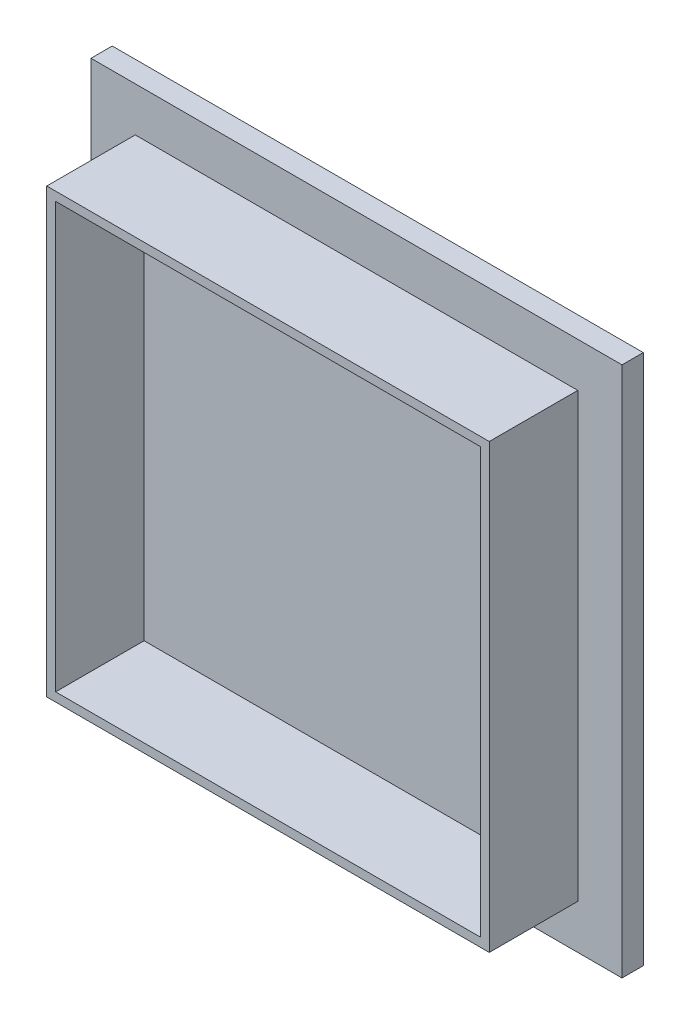
ISO-10303-21;
HEADER;
FILE_DESCRIPTION(('STEP AP214'),'2;1');
FILE_NAME('part.step','',(''),(''),'','','');
FILE_SCHEMA(('AUTOMOTIVE_DESIGN { 1 0 10303 214 1 1 1 1 }'));
ENDSEC;
DATA;
#1=APPLICATION_CONTEXT('core data for automotive mechanical design processes');
#2=APPLICATION_PROTOCOL_DEFINITION('international standard','automotive_design',2000,#1);
#3=PRODUCT_CONTEXT('',#1,'mechanical');
#4=PRODUCT('Part','Part','',(#3));
#5=PRODUCT_RELATED_PRODUCT_CATEGORY('part','',(#4));
#6=PRODUCT_DEFINITION_FORMATION('','',#4);
#7=PRODUCT_DEFINITION_CONTEXT('part definition',#1,'design');
#8=PRODUCT_DEFINITION('design','',#6,#7);
#9=PRODUCT_DEFINITION_SHAPE('','',#8);
#10=(LENGTH_UNIT() NAMED_UNIT(*) SI_UNIT(.MILLI.,.METRE.));
#11=(NAMED_UNIT(*) PLANE_ANGLE_UNIT() SI_UNIT($,.RADIAN.));
#12=(NAMED_UNIT(*) SI_UNIT($,.STERADIAN.) SOLID_ANGLE_UNIT());
#13=UNCERTAINTY_MEASURE_WITH_UNIT(LENGTH_MEASURE(1.E-05),#10,'distance_accuracy_value','');
#14=(GEOMETRIC_REPRESENTATION_CONTEXT(3) GLOBAL_UNCERTAINTY_ASSIGNED_CONTEXT((#13)) GLOBAL_UNIT_ASSIGNED_CONTEXT((#10,
#11,#12)) REPRESENTATION_CONTEXT('',''));
#15=CARTESIAN_POINT('',(0.,0.,0.));
#16=DIRECTION('',(0.,0.,1.));
#17=DIRECTION('',(1.,0.,0.));
#18=AXIS2_PLACEMENT_3D('',#15,#16,#17);
#19=CARTESIAN_POINT('',(150.,150.,12.));
#20=DIRECTION('',(-1.,0.,0.));
#21=DIRECTION('',(0.,-1.,0.));
#22=AXIS2_PLACEMENT_3D('',#19,#20,#21);
#23=PLANE('',#22);
#24=DIRECTION('',(0.,1.,0.));
#25=VECTOR('',#24,1.);
#26=CARTESIAN_POINT('',(150.,150.,0.));
#27=LINE('',#26,#25);
#28=CARTESIAN_POINT('',(150.,-150.,0.));
#29=VERTEX_POINT('',#28);
#30=CARTESIAN_POINT('',(150.,150.,0.));
#31=VERTEX_POINT('',#30);
#32=EDGE_CURVE('E365',#29,#31,#27,.T.);
#33=ORIENTED_EDGE('',*,*,#32,.T.);
#34=DIRECTION('',(0.,0.,-1.));
#35=VECTOR('',#34,1.);
#36=CARTESIAN_POINT('',(150.,150.,12.));
#37=LINE('',#36,#35);
#38=CARTESIAN_POINT('',(150.,150.,12.));
#39=VERTEX_POINT('',#38);
#40=EDGE_CURVE('E11',#39,#31,#37,.T.);
#41=ORIENTED_EDGE('',*,*,#40,.F.);
#42=DIRECTION('',(0.,1.,0.));
#43=VECTOR('',#42,1.);
#44=CARTESIAN_POINT('',(150.,150.,12.));
#45=LINE('',#44,#43);
#46=CARTESIAN_POINT('',(150.,-150.,12.));
#47=VERTEX_POINT('',#46);
#48=EDGE_CURVE('E366',#47,#39,#45,.T.);
#49=ORIENTED_EDGE('',*,*,#48,.F.);
#50=DIRECTION('',(0.,0.,-1.));
#51=VECTOR('',#50,1.);
#52=CARTESIAN_POINT('',(150.,-150.,12.));
#53=LINE('',#52,#51);
#54=EDGE_CURVE('E380',#47,#29,#53,.T.);
#55=ORIENTED_EDGE('',*,*,#54,.T.);
#56=EDGE_LOOP('',(#33,#41,#49,#55));
#57=FACE_BOUND('',#56,.T.);
#58=ADVANCED_FACE('F39',(#57),#23,.F.);
#59=CARTESIAN_POINT('',(-150.,150.,12.));
#60=DIRECTION('',(0.,-1.,0.));
#61=DIRECTION('',(0.,0.,-1.));
#62=AXIS2_PLACEMENT_3D('',#59,#60,#61);
#63=PLANE('',#62);
#64=DIRECTION('',(-1.,0.,0.));
#65=VECTOR('',#64,1.);
#66=CARTESIAN_POINT('',(-150.,150.,0.));
#67=LINE('',#66,#65);
#68=CARTESIAN_POINT('',(-150.,150.,0.));
#69=VERTEX_POINT('',#68);
#70=EDGE_CURVE('E384',#31,#69,#67,.T.);
#71=ORIENTED_EDGE('',*,*,#70,.T.);
#72=DIRECTION('',(0.,0.,-1.));
#73=VECTOR('',#72,1.);
#74=CARTESIAN_POINT('',(-150.,150.,12.));
#75=LINE('',#74,#73);
#76=CARTESIAN_POINT('',(-150.,150.,12.));
#77=VERTEX_POINT('',#76);
#78=EDGE_CURVE('E47',#77,#69,#75,.T.);
#79=ORIENTED_EDGE('',*,*,#78,.F.);
#80=DIRECTION('',(-1.,0.,0.));
#81=VECTOR('',#80,1.);
#82=CARTESIAN_POINT('',(-150.,150.,12.));
#83=LINE('',#82,#81);
#84=EDGE_CURVE('E370',#39,#77,#83,.T.);
#85=ORIENTED_EDGE('',*,*,#84,.F.);
#86=ORIENTED_EDGE('',*,*,#40,.T.);
#87=EDGE_LOOP('',(#71,#79,#85,#86));
#88=FACE_BOUND('',#87,.T.);
#89=ADVANCED_FACE('F420',(#88),#63,.F.);
#90=CARTESIAN_POINT('',(-150.,150.,12.));
#91=DIRECTION('',(1.,0.,0.));
#92=DIRECTION('',(0.,1.,0.));
#93=AXIS2_PLACEMENT_3D('',#90,#91,#92);
#94=PLANE('',#93);
#95=DIRECTION('',(0.,-1.,0.));
#96=VECTOR('',#95,1.);
#97=CARTESIAN_POINT('',(-150.,150.,0.));
#98=LINE('',#97,#96);
#99=CARTESIAN_POINT('',(-150.,-150.,0.));
#100=VERTEX_POINT('',#99);
#101=EDGE_CURVE('E387',#69,#100,#98,.T.);
#102=ORIENTED_EDGE('',*,*,#101,.T.);
#103=DIRECTION('',(0.,0.,-1.));
#104=VECTOR('',#103,1.);
#105=CARTESIAN_POINT('',(-150.,-150.,12.));
#106=LINE('',#105,#104);
#107=CARTESIAN_POINT('',(-150.,-150.,12.));
#108=VERTEX_POINT('',#107);
#109=EDGE_CURVE('E395',#108,#100,#106,.T.);
#110=ORIENTED_EDGE('',*,*,#109,.F.);
#111=DIRECTION('',(0.,-1.,0.));
#112=VECTOR('',#111,1.);
#113=CARTESIAN_POINT('',(-150.,150.,12.));
#114=LINE('',#113,#112);
#115=EDGE_CURVE('E374',#77,#108,#114,.T.);
#116=ORIENTED_EDGE('',*,*,#115,.F.);
#117=ORIENTED_EDGE('',*,*,#78,.T.);
#118=EDGE_LOOP('',(#102,#110,#116,#117));
#119=FACE_BOUND('',#118,.T.);
#120=ADVANCED_FACE('F404',(#119),#94,.F.);
#121=CARTESIAN_POINT('',(-150.,-150.,12.));
#122=DIRECTION('',(0.,1.,0.));
#123=DIRECTION('',(0.,0.,1.));
#124=AXIS2_PLACEMENT_3D('',#121,#122,#123);
#125=PLANE('',#124);
#126=DIRECTION('',(1.,0.,0.));
#127=VECTOR('',#126,1.);
#128=CARTESIAN_POINT('',(-150.,-150.,0.));
#129=LINE('',#128,#127);
#130=EDGE_CURVE('E371',#100,#29,#129,.T.);
#131=ORIENTED_EDGE('',*,*,#130,.T.);
#132=ORIENTED_EDGE('',*,*,#54,.F.);
#133=DIRECTION('',(1.,0.,0.));
#134=VECTOR('',#133,1.);
#135=CARTESIAN_POINT('',(-150.,-150.,12.));
#136=LINE('',#135,#134);
#137=EDGE_CURVE('E377',#108,#47,#136,.T.);
#138=ORIENTED_EDGE('',*,*,#137,.F.);
#139=ORIENTED_EDGE('',*,*,#109,.T.);
#140=EDGE_LOOP('',(#131,#132,#138,#139));
#141=FACE_BOUND('',#140,.T.);
#142=ADVANCED_FACE('F413',(#141),#125,.F.);
#143=CARTESIAN_POINT('',(0.,0.,12.));
#144=DIRECTION('',(0.,0.,1.));
#145=DIRECTION('',(1.,0.,0.));
#146=AXIS2_PLACEMENT_3D('',#143,#144,#145);
#147=PLANE('',#146);
#148=DIRECTION('',(0.,1.,0.));
#149=VECTOR('',#148,1.);
#150=CARTESIAN_POINT('',(125.,125.,12.));
#151=LINE('',#150,#149);
#152=CARTESIAN_POINT('',(125.,-125.,12.));
#153=VERTEX_POINT('',#152);
#154=CARTESIAN_POINT('',(125.,125.,12.));
#155=VERTEX_POINT('',#154);
#156=EDGE_CURVE('E310',#153,#155,#151,.T.);
#157=ORIENTED_EDGE('',*,*,#156,.F.);
#158=DIRECTION('',(1.,0.,0.));
#159=VECTOR('',#158,1.);
#160=CARTESIAN_POINT('',(-125.,-125.,12.));
#161=LINE('',#160,#159);
#162=CARTESIAN_POINT('',(-125.,-125.,12.));
#163=VERTEX_POINT('',#162);
#164=EDGE_CURVE('E326',#163,#153,#161,.T.);
#165=ORIENTED_EDGE('',*,*,#164,.F.);
#166=DIRECTION('',(0.,-1.,0.));
#167=VECTOR('',#166,1.);
#168=CARTESIAN_POINT('',(-125.,125.,12.));
#169=LINE('',#168,#167);
#170=CARTESIAN_POINT('',(-125.,125.,12.));
#171=VERTEX_POINT('',#170);
#172=EDGE_CURVE('E343',#171,#163,#169,.T.);
#173=ORIENTED_EDGE('',*,*,#172,.F.);
#174=DIRECTION('',(-1.,0.,0.));
#175=VECTOR('',#174,1.);
#176=CARTESIAN_POINT('',(-125.,125.,12.));
#177=LINE('',#176,#175);
#178=EDGE_CURVE('E339',#155,#171,#177,.T.);
#179=ORIENTED_EDGE('',*,*,#178,.F.);
#180=EDGE_LOOP('',(#157,#165,#173,#179));
#181=FACE_BOUND('',#180,.T.);
#182=ORIENTED_EDGE('',*,*,#48,.T.);
#183=ORIENTED_EDGE('',*,*,#84,.T.);
#184=ORIENTED_EDGE('',*,*,#115,.T.);
#185=ORIENTED_EDGE('',*,*,#137,.T.);
#186=EDGE_LOOP('',(#182,#183,#184,#185));
#187=FACE_BOUND('',#186,.T.);
#188=ADVANCED_FACE('F419',(#181,#187),#147,.T.);
#189=CARTESIAN_POINT('',(0.,0.,0.));
#190=DIRECTION('',(0.,0.,1.));
#191=DIRECTION('',(1.,0.,0.));
#192=AXIS2_PLACEMENT_3D('',#189,#190,#191);
#193=PLANE('',#192);
#194=DIRECTION('',(-1.,0.,0.));
#195=VECTOR('',#194,1.);
#196=CARTESIAN_POINT('',(15.,67.4999999999999,0.));
#197=LINE('',#196,#195);
#198=CARTESIAN_POINT('',(15.,67.4999999999999,0.));
#199=VERTEX_POINT('',#198);
#200=CARTESIAN_POINT('',(-14.9999999999999,67.4999999999999,0.));
#201=VERTEX_POINT('',#200);
#202=EDGE_CURVE('E295',#199,#201,#197,.T.);
#203=ORIENTED_EDGE('',*,*,#202,.F.);
#204=CARTESIAN_POINT('',(15.,80.,0.));
#205=DIRECTION('',(0.,0.,-1.));
#206=DIRECTION('',(-1.,0.,0.));
#207=AXIS2_PLACEMENT_3D('',#204,#205,#206);
#208=CIRCLE('',#207,12.5);
#209=CARTESIAN_POINT('',(15.,92.5,0.));
#210=VERTEX_POINT('',#209);
#211=EDGE_CURVE('E62',#210,#199,#208,.T.);
#212=ORIENTED_EDGE('',*,*,#211,.F.);
#213=DIRECTION('',(1.,0.,0.));
#214=VECTOR('',#213,1.);
#215=CARTESIAN_POINT('',(15.,92.5,0.));
#216=LINE('',#215,#214);
#217=CARTESIAN_POINT('',(-14.9999999999999,92.5,0.));
#218=VERTEX_POINT('',#217);
#219=EDGE_CURVE('E284',#218,#210,#216,.T.);
#220=ORIENTED_EDGE('',*,*,#219,.F.);
#221=CARTESIAN_POINT('',(-14.9999999999999,80.,0.));
#222=DIRECTION('',(0.,0.,-1.));
#223=DIRECTION('',(-1.,0.,0.));
#224=AXIS2_PLACEMENT_3D('',#221,#222,#223);
#225=CIRCLE('',#224,12.5);
#226=EDGE_CURVE('E299',#201,#218,#225,.T.);
#227=ORIENTED_EDGE('',*,*,#226,.F.);
#228=EDGE_LOOP('',(#203,#212,#220,#227));
#229=FACE_BOUND('',#228,.T.);
#230=ORIENTED_EDGE('',*,*,#32,.F.);
#231=ORIENTED_EDGE('',*,*,#130,.F.);
#232=ORIENTED_EDGE('',*,*,#101,.F.);
#233=ORIENTED_EDGE('',*,*,#70,.F.);
#234=EDGE_LOOP('',(#230,#231,#232,#233));
#235=FACE_BOUND('',#234,.T.);
#236=ADVANCED_FACE('F410',(#229,#235),#193,.F.);
#237=CARTESIAN_POINT('',(125.,125.,62.));
#238=DIRECTION('',(-1.,0.,0.));
#239=DIRECTION('',(0.,0.,1.));
#240=AXIS2_PLACEMENT_3D('',#237,#238,#239);
#241=PLANE('',#240);
#242=ORIENTED_EDGE('',*,*,#156,.T.);
#243=DIRECTION('',(0.,0.,-1.));
#244=VECTOR('',#243,1.);
#245=CARTESIAN_POINT('',(125.,125.,62.));
#246=LINE('',#245,#244);
#247=CARTESIAN_POINT('',(125.,125.,62.));
#248=VERTEX_POINT('',#247);
#249=EDGE_CURVE('E361',#248,#155,#246,.T.);
#250=ORIENTED_EDGE('',*,*,#249,.F.);
#251=DIRECTION('',(0.,1.,0.));
#252=VECTOR('',#251,1.);
#253=CARTESIAN_POINT('',(125.,125.,62.));
#254=LINE('',#253,#252);
#255=CARTESIAN_POINT('',(125.,-125.,62.));
#256=VERTEX_POINT('',#255);
#257=EDGE_CURVE('E321',#256,#248,#254,.T.);
#258=ORIENTED_EDGE('',*,*,#257,.F.);
#259=DIRECTION('',(0.,0.,-1.));
#260=VECTOR('',#259,1.);
#261=CARTESIAN_POINT('',(125.,-125.,62.));
#262=LINE('',#261,#260);
#263=EDGE_CURVE('E335',#256,#153,#262,.T.);
#264=ORIENTED_EDGE('',*,*,#263,.T.);
#265=EDGE_LOOP('',(#242,#250,#258,#264));
#266=FACE_BOUND('',#265,.T.);
#267=ADVANCED_FACE('F432',(#266),#241,.F.);
#268=CARTESIAN_POINT('',(-125.,125.,62.));
#269=DIRECTION('',(0.,-1.,0.));
#270=DIRECTION('',(0.,0.,-1.));
#271=AXIS2_PLACEMENT_3D('',#268,#269,#270);
#272=PLANE('',#271);
#273=ORIENTED_EDGE('',*,*,#178,.T.);
#274=DIRECTION('',(0.,0.,-1.));
#275=VECTOR('',#274,1.);
#276=CARTESIAN_POINT('',(-125.,125.,62.));
#277=LINE('',#276,#275);
#278=CARTESIAN_POINT('',(-125.,125.,62.));
#279=VERTEX_POINT('',#278);
#280=EDGE_CURVE('E357',#279,#171,#277,.T.);
#281=ORIENTED_EDGE('',*,*,#280,.F.);
#282=DIRECTION('',(-1.,0.,0.));
#283=VECTOR('',#282,1.);
#284=CARTESIAN_POINT('',(-125.,125.,62.));
#285=LINE('',#284,#283);
#286=EDGE_CURVE('E325',#248,#279,#285,.T.);
#287=ORIENTED_EDGE('',*,*,#286,.F.);
#288=ORIENTED_EDGE('',*,*,#249,.T.);
#289=EDGE_LOOP('',(#273,#281,#287,#288));
#290=FACE_BOUND('',#289,.T.);
#291=ADVANCED_FACE('F439',(#290),#272,.F.);
#292=CARTESIAN_POINT('',(-125.,125.,62.));
#293=DIRECTION('',(1.,0.,0.));
#294=DIRECTION('',(0.,1.,0.));
#295=AXIS2_PLACEMENT_3D('',#292,#293,#294);
#296=PLANE('',#295);
#297=ORIENTED_EDGE('',*,*,#172,.T.);
#298=DIRECTION('',(0.,0.,-1.));
#299=VECTOR('',#298,1.);
#300=CARTESIAN_POINT('',(-125.,-125.,62.));
#301=LINE('',#300,#299);
#302=CARTESIAN_POINT('',(-125.,-125.,62.));
#303=VERTEX_POINT('',#302);
#304=EDGE_CURVE('E353',#303,#163,#301,.T.);
#305=ORIENTED_EDGE('',*,*,#304,.F.);
#306=DIRECTION('',(0.,-1.,0.));
#307=VECTOR('',#306,1.);
#308=CARTESIAN_POINT('',(-125.,125.,62.));
#309=LINE('',#308,#307);
#310=EDGE_CURVE('E329',#279,#303,#309,.T.);
#311=ORIENTED_EDGE('',*,*,#310,.F.);
#312=ORIENTED_EDGE('',*,*,#280,.T.);
#313=EDGE_LOOP('',(#297,#305,#311,#312));
#314=FACE_BOUND('',#313,.T.);
#315=ADVANCED_FACE('F443',(#314),#296,.F.);
#316=CARTESIAN_POINT('',(-125.,-125.,62.));
#317=DIRECTION('',(0.,1.,0.));
#318=DIRECTION('',(0.,0.,1.));
#319=AXIS2_PLACEMENT_3D('',#316,#317,#318);
#320=PLANE('',#319);
#321=ORIENTED_EDGE('',*,*,#164,.T.);
#322=ORIENTED_EDGE('',*,*,#263,.F.);
#323=DIRECTION('',(1.,0.,0.));
#324=VECTOR('',#323,1.);
#325=CARTESIAN_POINT('',(-125.,-125.,62.));
#326=LINE('',#325,#324);
#327=EDGE_CURVE('E332',#303,#256,#326,.T.);
#328=ORIENTED_EDGE('',*,*,#327,.F.);
#329=ORIENTED_EDGE('',*,*,#304,.T.);
#330=EDGE_LOOP('',(#321,#322,#328,#329));
#331=FACE_BOUND('',#330,.T.);
#332=ADVANCED_FACE('F447',(#331),#320,.F.);
#333=CARTESIAN_POINT('',(0.,0.,62.));
#334=DIRECTION('',(0.,0.,1.));
#335=DIRECTION('',(1.,0.,0.));
#336=AXIS2_PLACEMENT_3D('',#333,#334,#335);
#337=PLANE('',#336);
#338=DIRECTION('',(0.,1.,0.));
#339=VECTOR('',#338,1.);
#340=CARTESIAN_POINT('',(120.,120.,62.));
#341=LINE('',#340,#339);
#342=CARTESIAN_POINT('',(120.,-120.,62.));
#343=VERTEX_POINT('',#342);
#344=CARTESIAN_POINT('',(120.,120.,62.));
#345=VERTEX_POINT('',#344);
#346=EDGE_CURVE('E54',#343,#345,#341,.T.);
#347=ORIENTED_EDGE('',*,*,#346,.F.);
#348=DIRECTION('',(1.,0.,0.));
#349=VECTOR('',#348,1.);
#350=CARTESIAN_POINT('',(-120.,-120.,62.));
#351=LINE('',#350,#349);
#352=CARTESIAN_POINT('',(-120.,-120.,62.));
#353=VERTEX_POINT('',#352);
#354=EDGE_CURVE('E205',#353,#343,#351,.T.);
#355=ORIENTED_EDGE('',*,*,#354,.F.);
#356=DIRECTION('',(0.,-1.,0.));
#357=VECTOR('',#356,1.);
#358=CARTESIAN_POINT('',(-120.,120.,62.));
#359=LINE('',#358,#357);
#360=CARTESIAN_POINT('',(-120.,120.,62.));
#361=VERTEX_POINT('',#360);
#362=EDGE_CURVE('E209',#361,#353,#359,.T.);
#363=ORIENTED_EDGE('',*,*,#362,.F.);
#364=DIRECTION('',(-1.,0.,0.));
#365=VECTOR('',#364,1.);
#366=CARTESIAN_POINT('',(-120.,120.,62.));
#367=LINE('',#366,#365);
#368=EDGE_CURVE('E218',#345,#361,#367,.T.);
#369=ORIENTED_EDGE('',*,*,#368,.F.);
#370=EDGE_LOOP('',(#347,#355,#363,#369));
#371=FACE_BOUND('',#370,.T.);
#372=ORIENTED_EDGE('',*,*,#257,.T.);
#373=ORIENTED_EDGE('',*,*,#286,.T.);
#374=ORIENTED_EDGE('',*,*,#310,.T.);
#375=ORIENTED_EDGE('',*,*,#327,.T.);
#376=EDGE_LOOP('',(#372,#373,#374,#375));
#377=FACE_BOUND('',#376,.T.);
#378=ADVANCED_FACE('F451',(#371,#377),#337,.T.);
#379=CARTESIAN_POINT('',(15.,80.,10.));
#380=DIRECTION('',(0.,0.,-1.));
#381=DIRECTION('',(-1.,0.,0.));
#382=AXIS2_PLACEMENT_3D('',#379,#380,#381);
#383=CYLINDRICAL_SURFACE('',#382,12.5);
#384=ORIENTED_EDGE('',*,*,#211,.T.);
#385=DIRECTION('',(0.,0.,-1.));
#386=VECTOR('',#385,1.);
#387=CARTESIAN_POINT('',(15.,67.4999999999999,10.));
#388=LINE('',#387,#386);
#389=CARTESIAN_POINT('',(15.,67.4999999999999,10.));
#390=VERTEX_POINT('',#389);
#391=EDGE_CURVE('E292',#390,#199,#388,.T.);
#392=ORIENTED_EDGE('',*,*,#391,.F.);
#393=CARTESIAN_POINT('',(15.,80.,10.));
#394=DIRECTION('',(0.,0.,-1.));
#395=DIRECTION('',(-1.,0.,0.));
#396=AXIS2_PLACEMENT_3D('',#393,#394,#395);
#397=CIRCLE('',#396,12.5);
#398=CARTESIAN_POINT('',(15.,92.5,10.));
#399=VERTEX_POINT('',#398);
#400=EDGE_CURVE('E279',#399,#390,#397,.T.);
#401=ORIENTED_EDGE('',*,*,#400,.F.);
#402=DIRECTION('',(0.,0.,-1.));
#403=VECTOR('',#402,1.);
#404=CARTESIAN_POINT('',(15.,92.5,10.));
#405=LINE('',#404,#403);
#406=CARTESIAN_POINT('',(15.,92.5,5.));
#407=VERTEX_POINT('',#406);
#408=EDGE_CURVE('E306',#399,#407,#405,.T.);
#409=ORIENTED_EDGE('',*,*,#408,.T.);
#410=EDGE_CURVE('E311',#407,#210,#405,.T.);
#411=ORIENTED_EDGE('',*,*,#410,.T.);
#412=EDGE_LOOP('',(#384,#392,#401,#409,#411));
#413=FACE_BOUND('',#412,.T.);
#414=ADVANCED_FACE('F455',(#413),#383,.F.);
#415=CARTESIAN_POINT('',(15.,92.5,10.));
#416=DIRECTION('',(0.,1.,0.));
#417=DIRECTION('',(0.,0.,1.));
#418=AXIS2_PLACEMENT_3D('',#415,#416,#417);
#419=PLANE('',#418);
#420=ORIENTED_EDGE('',*,*,#410,.F.);
#421=DIRECTION('',(-1.,0.,0.));
#422=VECTOR('',#421,1.);
#423=CARTESIAN_POINT('',(27.9110347861365,92.5,5.));
#424=LINE('',#423,#422);
#425=CARTESIAN_POINT('',(-14.9999999999999,92.5,5.));
#426=VERTEX_POINT('',#425);
#427=EDGE_CURVE('E266',#407,#426,#424,.T.);
#428=ORIENTED_EDGE('',*,*,#427,.T.);
#429=DIRECTION('',(0.,0.,-1.));
#430=VECTOR('',#429,1.);
#431=CARTESIAN_POINT('',(-14.9999999999999,92.5,10.));
#432=LINE('',#431,#430);
#433=EDGE_CURVE('E315',#426,#218,#432,.T.);
#434=ORIENTED_EDGE('',*,*,#433,.T.);
#435=ORIENTED_EDGE('',*,*,#219,.T.);
#436=EDGE_LOOP('',(#420,#428,#434,#435));
#437=FACE_BOUND('',#436,.T.);
#438=ADVANCED_FACE('F459',(#437),#419,.F.);
#439=CARTESIAN_POINT('',(-14.9999999999999,80.,10.));
#440=DIRECTION('',(0.,0.,-1.));
#441=DIRECTION('',(-1.,0.,0.));
#442=AXIS2_PLACEMENT_3D('',#439,#440,#441);
#443=CYLINDRICAL_SURFACE('',#442,12.5);
#444=ORIENTED_EDGE('',*,*,#226,.T.);
#445=ORIENTED_EDGE('',*,*,#433,.F.);
#446=CARTESIAN_POINT('',(-14.9999999999999,92.5,10.));
#447=VERTEX_POINT('',#446);
#448=EDGE_CURVE('E312',#447,#426,#432,.T.);
#449=ORIENTED_EDGE('',*,*,#448,.F.);
#450=CARTESIAN_POINT('',(-14.9999999999999,80.,10.));
#451=DIRECTION('',(0.,0.,-1.));
#452=DIRECTION('',(-1.,0.,0.));
#453=AXIS2_PLACEMENT_3D('',#450,#451,#452);
#454=CIRCLE('',#453,12.5);
#455=CARTESIAN_POINT('',(-14.9999999999999,67.4999999999999,10.));
#456=VERTEX_POINT('',#455);
#457=EDGE_CURVE('E288',#456,#447,#454,.T.);
#458=ORIENTED_EDGE('',*,*,#457,.F.);
#459=DIRECTION('',(0.,0.,-1.));
#460=VECTOR('',#459,1.);
#461=CARTESIAN_POINT('',(-14.9999999999999,67.4999999999999,10.));
#462=LINE('',#461,#460);
#463=EDGE_CURVE('E316',#456,#201,#462,.T.);
#464=ORIENTED_EDGE('',*,*,#463,.T.);
#465=EDGE_LOOP('',(#444,#445,#449,#458,#464));
#466=FACE_BOUND('',#465,.T.);
#467=ADVANCED_FACE('F464',(#466),#443,.F.);
#468=CARTESIAN_POINT('',(15.,67.4999999999999,10.));
#469=DIRECTION('',(0.,-1.,0.));
#470=DIRECTION('',(0.,0.,-1.));
#471=AXIS2_PLACEMENT_3D('',#468,#469,#470);
#472=PLANE('',#471);
#473=ORIENTED_EDGE('',*,*,#202,.T.);
#474=ORIENTED_EDGE('',*,*,#463,.F.);
#475=DIRECTION('',(-1.,0.,0.));
#476=VECTOR('',#475,1.);
#477=CARTESIAN_POINT('',(15.,67.4999999999999,10.));
#478=LINE('',#477,#476);
#479=EDGE_CURVE('E283',#390,#456,#478,.T.);
#480=ORIENTED_EDGE('',*,*,#479,.F.);
#481=ORIENTED_EDGE('',*,*,#391,.T.);
#482=EDGE_LOOP('',(#473,#474,#480,#481));
#483=FACE_BOUND('',#482,.T.);
#484=ADVANCED_FACE('F460',(#483),#472,.F.);
#485=CARTESIAN_POINT('',(15.,80.,10.));
#486=DIRECTION('',(0.,0.,-1.));
#487=DIRECTION('',(-1.,0.,0.));
#488=AXIS2_PLACEMENT_3D('',#485,#486,#487);
#489=PLANE('',#488);
#490=ORIENTED_EDGE('',*,*,#400,.T.);
#491=ORIENTED_EDGE('',*,*,#479,.T.);
#492=ORIENTED_EDGE('',*,*,#457,.T.);
#493=DIRECTION('',(-1.,0.,0.));
#494=VECTOR('',#493,1.);
#495=CARTESIAN_POINT('',(27.9110347861365,92.5,10.));
#496=LINE('',#495,#494);
#497=CARTESIAN_POINT('',(-27.0889652138635,92.5,10.));
#498=VERTEX_POINT('',#497);
#499=EDGE_CURVE('E246',#447,#498,#496,.T.);
#500=ORIENTED_EDGE('',*,*,#499,.T.);
#501=DIRECTION('',(0.,1.,0.));
#502=VECTOR('',#501,1.);
#503=CARTESIAN_POINT('',(-27.0889652138635,135.976241007239,10.));
#504=LINE('',#503,#502);
#505=CARTESIAN_POINT('',(-27.0889652138635,135.976241007239,10.));
#506=VERTEX_POINT('',#505);
#507=EDGE_CURVE('E233',#498,#506,#504,.T.);
#508=ORIENTED_EDGE('',*,*,#507,.T.);
#509=DIRECTION('',(1.,0.,0.));
#510=VECTOR('',#509,1.);
#511=CARTESIAN_POINT('',(27.9110347861365,135.976241007239,10.));
#512=LINE('',#511,#510);
#513=CARTESIAN_POINT('',(27.9110347861365,135.976241007239,10.));
#514=VERTEX_POINT('',#513);
#515=EDGE_CURVE('E237',#506,#514,#512,.T.);
#516=ORIENTED_EDGE('',*,*,#515,.T.);
#517=DIRECTION('',(0.,-1.,0.));
#518=VECTOR('',#517,1.);
#519=CARTESIAN_POINT('',(27.9110347861365,135.976241007239,10.));
#520=LINE('',#519,#518);
#521=CARTESIAN_POINT('',(27.9110347861365,92.5,10.));
#522=VERTEX_POINT('',#521);
#523=EDGE_CURVE('E242',#514,#522,#520,.T.);
#524=ORIENTED_EDGE('',*,*,#523,.T.);
#525=EDGE_CURVE('E247',#522,#399,#496,.T.);
#526=ORIENTED_EDGE('',*,*,#525,.T.);
#527=EDGE_LOOP('',(#490,#491,#492,#500,#508,#516,#524,#526));
#528=FACE_BOUND('',#527,.T.);
#529=ADVANCED_FACE('F463',(#528),#489,.T.);
#530=CARTESIAN_POINT('',(27.9110347861365,92.5,10.));
#531=DIRECTION('',(0.,-1.,0.));
#532=DIRECTION('',(0.,0.,-1.));
#533=AXIS2_PLACEMENT_3D('',#530,#531,#532);
#534=PLANE('',#533);
#535=CARTESIAN_POINT('',(-27.0889652138635,92.5,5.));
#536=VERTEX_POINT('',#535);
#537=EDGE_CURVE('E262',#426,#536,#424,.T.);
#538=ORIENTED_EDGE('',*,*,#537,.T.);
#539=DIRECTION('',(0.,0.,-1.));
#540=VECTOR('',#539,1.);
#541=CARTESIAN_POINT('',(-27.0889652138635,92.5,10.));
#542=LINE('',#541,#540);
#543=EDGE_CURVE('E267',#498,#536,#542,.T.);
#544=ORIENTED_EDGE('',*,*,#543,.F.);
#545=ORIENTED_EDGE('',*,*,#499,.F.);
#546=ORIENTED_EDGE('',*,*,#448,.T.);
#547=EDGE_LOOP('',(#538,#544,#545,#546));
#548=FACE_BOUND('',#547,.T.);
#549=ADVANCED_FACE('F474',(#548),#534,.F.);
#550=CARTESIAN_POINT('',(-27.0889652138635,135.976241007239,10.));
#551=DIRECTION('',(-1.,0.,0.));
#552=DIRECTION('',(0.,-1.,0.));
#553=AXIS2_PLACEMENT_3D('',#550,#551,#552);
#554=PLANE('',#553);
#555=DIRECTION('',(0.,1.,0.));
#556=VECTOR('',#555,1.);
#557=CARTESIAN_POINT('',(-27.0889652138635,135.976241007239,5.));
#558=LINE('',#557,#556);
#559=CARTESIAN_POINT('',(-27.0889652138635,135.976241007239,5.));
#560=VERTEX_POINT('',#559);
#561=EDGE_CURVE('E227',#536,#560,#558,.T.);
#562=ORIENTED_EDGE('',*,*,#561,.T.);
#563=DIRECTION('',(0.,0.,-1.));
#564=VECTOR('',#563,1.);
#565=CARTESIAN_POINT('',(-27.0889652138635,135.976241007239,10.));
#566=LINE('',#565,#564);
#567=EDGE_CURVE('E250',#506,#560,#566,.T.);
#568=ORIENTED_EDGE('',*,*,#567,.F.);
#569=ORIENTED_EDGE('',*,*,#507,.F.);
#570=ORIENTED_EDGE('',*,*,#543,.T.);
#571=EDGE_LOOP('',(#562,#568,#569,#570));
#572=FACE_BOUND('',#571,.T.);
#573=ADVANCED_FACE('F476',(#572),#554,.F.);
#574=ORIENTED_EDGE('',*,*,#408,.F.);
#575=ORIENTED_EDGE('',*,*,#525,.F.);
#576=DIRECTION('',(0.,0.,-1.));
#577=VECTOR('',#576,1.);
#578=CARTESIAN_POINT('',(27.9110347861365,92.5,10.));
#579=LINE('',#578,#577);
#580=CARTESIAN_POINT('',(27.9110347861365,92.5,5.));
#581=VERTEX_POINT('',#580);
#582=EDGE_CURVE('E271',#522,#581,#579,.T.);
#583=ORIENTED_EDGE('',*,*,#582,.T.);
#584=EDGE_CURVE('E238',#581,#407,#424,.T.);
#585=ORIENTED_EDGE('',*,*,#584,.T.);
#586=EDGE_LOOP('',(#574,#575,#583,#585));
#587=FACE_BOUND('',#586,.T.);
#588=ADVANCED_FACE('F479',(#587),#534,.F.);
#589=CARTESIAN_POINT('',(27.9110347861365,135.976241007239,10.));
#590=DIRECTION('',(1.,0.,0.));
#591=DIRECTION('',(0.,0.,-1.));
#592=AXIS2_PLACEMENT_3D('',#589,#590,#591);
#593=PLANE('',#592);
#594=DIRECTION('',(0.,-1.,0.));
#595=VECTOR('',#594,1.);
#596=CARTESIAN_POINT('',(27.9110347861365,135.976241007239,5.));
#597=LINE('',#596,#595);
#598=CARTESIAN_POINT('',(27.9110347861365,135.976241007239,5.));
#599=VERTEX_POINT('',#598);
#600=EDGE_CURVE('E258',#599,#581,#597,.T.);
#601=ORIENTED_EDGE('',*,*,#600,.T.);
#602=ORIENTED_EDGE('',*,*,#582,.F.);
#603=ORIENTED_EDGE('',*,*,#523,.F.);
#604=DIRECTION('',(0.,0.,-1.));
#605=VECTOR('',#604,1.);
#606=CARTESIAN_POINT('',(27.9110347861365,135.976241007239,10.));
#607=LINE('',#606,#605);
#608=EDGE_CURVE('E274',#514,#599,#607,.T.);
#609=ORIENTED_EDGE('',*,*,#608,.T.);
#610=EDGE_LOOP('',(#601,#602,#603,#609));
#611=FACE_BOUND('',#610,.T.);
#612=ADVANCED_FACE('F485',(#611),#593,.F.);
#613=CARTESIAN_POINT('',(27.9110347861365,135.976241007239,10.));
#614=DIRECTION('',(0.,1.,0.));
#615=DIRECTION('',(0.,0.,1.));
#616=AXIS2_PLACEMENT_3D('',#613,#614,#615);
#617=PLANE('',#616);
#618=DIRECTION('',(1.,0.,0.));
#619=VECTOR('',#618,1.);
#620=CARTESIAN_POINT('',(27.9110347861365,135.976241007239,5.));
#621=LINE('',#620,#619);
#622=EDGE_CURVE('E254',#560,#599,#621,.T.);
#623=ORIENTED_EDGE('',*,*,#622,.T.);
#624=ORIENTED_EDGE('',*,*,#608,.F.);
#625=ORIENTED_EDGE('',*,*,#515,.F.);
#626=ORIENTED_EDGE('',*,*,#567,.T.);
#627=EDGE_LOOP('',(#623,#624,#625,#626));
#628=FACE_BOUND('',#627,.T.);
#629=ADVANCED_FACE('F481',(#628),#617,.F.);
#630=CARTESIAN_POINT('',(0.,0.,5.));
#631=DIRECTION('',(0.,0.,-1.));
#632=DIRECTION('',(-1.,0.,0.));
#633=AXIS2_PLACEMENT_3D('',#630,#631,#632);
#634=PLANE('',#633);
#635=ORIENTED_EDGE('',*,*,#561,.F.);
#636=ORIENTED_EDGE('',*,*,#537,.F.);
#637=ORIENTED_EDGE('',*,*,#427,.F.);
#638=ORIENTED_EDGE('',*,*,#584,.F.);
#639=ORIENTED_EDGE('',*,*,#600,.F.);
#640=ORIENTED_EDGE('',*,*,#622,.F.);
#641=EDGE_LOOP('',(#635,#636,#637,#638,#639,#640));
#642=FACE_BOUND('',#641,.T.);
#643=ADVANCED_FACE('F484',(#642),#634,.F.);
#644=CARTESIAN_POINT('',(120.,120.,12.));
#645=DIRECTION('',(1.,0.,0.));
#646=DIRECTION('',(0.,1.,0.));
#647=AXIS2_PLACEMENT_3D('',#644,#645,#646);
#648=PLANE('',#647);
#649=ORIENTED_EDGE('',*,*,#346,.T.);
#650=DIRECTION('',(0.,0.,1.));
#651=VECTOR('',#650,1.);
#652=CARTESIAN_POINT('',(120.,120.,12.));
#653=LINE('',#652,#651);
#654=CARTESIAN_POINT('',(120.,120.,12.));
#655=VERTEX_POINT('',#654);
#656=EDGE_CURVE('E180',#655,#345,#653,.T.);
#657=ORIENTED_EDGE('',*,*,#656,.F.);
#658=DIRECTION('',(0.,1.,0.));
#659=VECTOR('',#658,1.);
#660=CARTESIAN_POINT('',(120.,120.,12.));
#661=LINE('',#660,#659);
#662=CARTESIAN_POINT('',(120.,-120.,12.));
#663=VERTEX_POINT('',#662);
#664=EDGE_CURVE('E184',#663,#655,#661,.T.);
#665=ORIENTED_EDGE('',*,*,#664,.F.);
#666=DIRECTION('',(0.,0.,1.));
#667=VECTOR('',#666,1.);
#668=CARTESIAN_POINT('',(120.,-120.,12.));
#669=LINE('',#668,#667);
#670=EDGE_CURVE('E224',#663,#343,#669,.T.);
#671=ORIENTED_EDGE('',*,*,#670,.T.);
#672=EDGE_LOOP('',(#649,#657,#665,#671));
#673=FACE_BOUND('',#672,.T.);
#674=ADVANCED_FACE('F182',(#673),#648,.F.);
#675=CARTESIAN_POINT('',(-120.,-120.,12.));
#676=DIRECTION('',(0.,-1.,0.));
#677=DIRECTION('',(0.,0.,-1.));
#678=AXIS2_PLACEMENT_3D('',#675,#676,#677);
#679=PLANE('',#678);
#680=ORIENTED_EDGE('',*,*,#354,.T.);
#681=ORIENTED_EDGE('',*,*,#670,.F.);
#682=DIRECTION('',(1.,0.,0.));
#683=VECTOR('',#682,1.);
#684=CARTESIAN_POINT('',(-120.,-120.,12.));
#685=LINE('',#684,#683);
#686=CARTESIAN_POINT('',(-120.,-120.,12.));
#687=VERTEX_POINT('',#686);
#688=EDGE_CURVE('E191',#687,#663,#685,.T.);
#689=ORIENTED_EDGE('',*,*,#688,.F.);
#690=DIRECTION('',(0.,0.,1.));
#691=VECTOR('',#690,1.);
#692=CARTESIAN_POINT('',(-120.,-120.,12.));
#693=LINE('',#692,#691);
#694=EDGE_CURVE('E228',#687,#353,#693,.T.);
#695=ORIENTED_EDGE('',*,*,#694,.T.);
#696=EDGE_LOOP('',(#680,#681,#689,#695));
#697=FACE_BOUND('',#696,.T.);
#698=ADVANCED_FACE('F498',(#697),#679,.F.);
#699=CARTESIAN_POINT('',(-120.,120.,12.));
#700=DIRECTION('',(-1.,0.,0.));
#701=DIRECTION('',(0.,-1.,0.));
#702=AXIS2_PLACEMENT_3D('',#699,#700,#701);
#703=PLANE('',#702);
#704=ORIENTED_EDGE('',*,*,#362,.T.);
#705=ORIENTED_EDGE('',*,*,#694,.F.);
#706=DIRECTION('',(0.,-1.,0.));
#707=VECTOR('',#706,1.);
#708=CARTESIAN_POINT('',(-120.,120.,12.));
#709=LINE('',#708,#707);
#710=CARTESIAN_POINT('',(-120.,120.,12.));
#711=VERTEX_POINT('',#710);
#712=EDGE_CURVE('E200',#711,#687,#709,.T.);
#713=ORIENTED_EDGE('',*,*,#712,.F.);
#714=DIRECTION('',(0.,0.,1.));
#715=VECTOR('',#714,1.);
#716=CARTESIAN_POINT('',(-120.,120.,12.));
#717=LINE('',#716,#715);
#718=EDGE_CURVE('E190',#711,#361,#717,.T.);
#719=ORIENTED_EDGE('',*,*,#718,.T.);
#720=EDGE_LOOP('',(#704,#705,#713,#719));
#721=FACE_BOUND('',#720,.T.);
#722=ADVANCED_FACE('F501',(#721),#703,.F.);
#723=CARTESIAN_POINT('',(-120.,120.,12.));
#724=DIRECTION('',(0.,1.,0.));
#725=DIRECTION('',(0.,0.,1.));
#726=AXIS2_PLACEMENT_3D('',#723,#724,#725);
#727=PLANE('',#726);
#728=ORIENTED_EDGE('',*,*,#368,.T.);
#729=ORIENTED_EDGE('',*,*,#718,.F.);
#730=DIRECTION('',(-1.,0.,0.));
#731=VECTOR('',#730,1.);
#732=CARTESIAN_POINT('',(-120.,120.,12.));
#733=LINE('',#732,#731);
#734=EDGE_CURVE('E194',#655,#711,#733,.T.);
#735=ORIENTED_EDGE('',*,*,#734,.F.);
#736=ORIENTED_EDGE('',*,*,#656,.T.);
#737=EDGE_LOOP('',(#728,#729,#735,#736));
#738=FACE_BOUND('',#737,.T.);
#739=ADVANCED_FACE('F195',(#738),#727,.F.);
#740=CARTESIAN_POINT('',(0.,0.,12.));
#741=DIRECTION('',(0.,0.,1.));
#742=DIRECTION('',(1.,0.,0.));
#743=AXIS2_PLACEMENT_3D('',#740,#741,#742);
#744=PLANE('',#743);
#745=ORIENTED_EDGE('',*,*,#664,.T.);
#746=ORIENTED_EDGE('',*,*,#734,.T.);
#747=ORIENTED_EDGE('',*,*,#712,.T.);
#748=ORIENTED_EDGE('',*,*,#688,.T.);
#749=EDGE_LOOP('',(#745,#746,#747,#748));
#750=FACE_BOUND('',#749,.T.);
#751=ADVANCED_FACE('F202',(#750),#744,.T.);
#752=CLOSED_SHELL('',(#58,#89,#120,#142,#188,#236,#267,#291,#315,#332,#378,#414,#438,#467,#484,
#529,#549,#573,#588,#612,#629,#643,#674,#698,#722,#739,#751));
#753=MANIFOLD_SOLID_BREP('B2',#752);
#754=ADVANCED_BREP_SHAPE_REPRESENTATION('',(#18,#753),#14);
#755=SHAPE_DEFINITION_REPRESENTATION(#9,#754);
ENDSEC;
END-ISO-10303-21;
